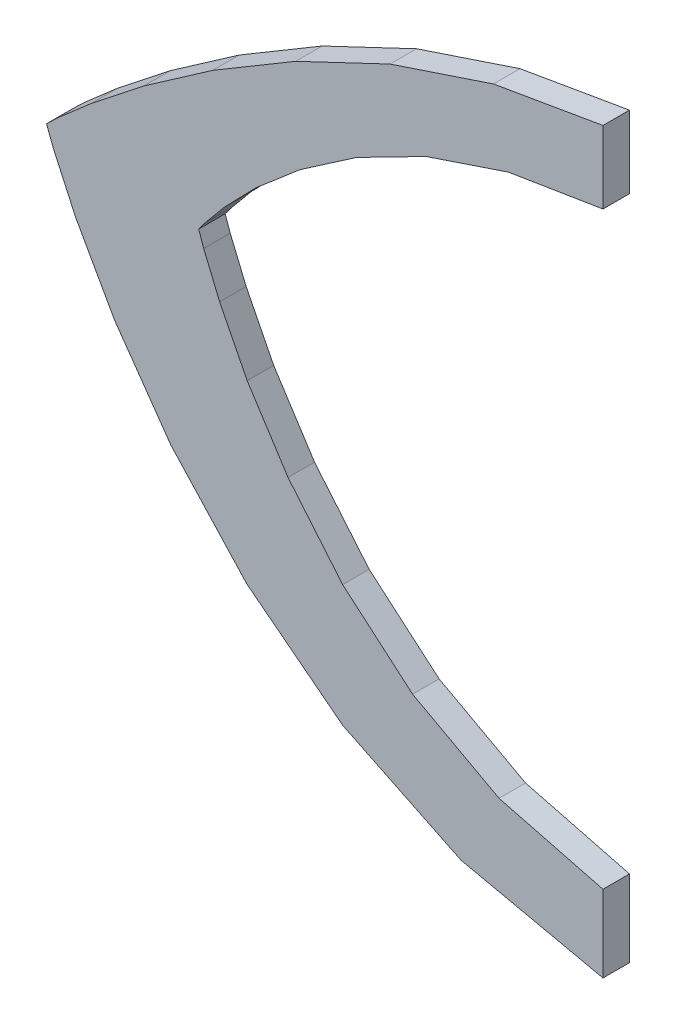
ISO-10303-21;
HEADER;
FILE_DESCRIPTION(('STEP AP214'),'2;1');
FILE_NAME('part.step','',(''),(''),'','','');
FILE_SCHEMA(('AUTOMOTIVE_DESIGN { 1 0 10303 214 1 1 1 1 }'));
ENDSEC;
DATA;
#1=APPLICATION_CONTEXT('core data for automotive mechanical design processes');
#2=APPLICATION_PROTOCOL_DEFINITION('international standard','automotive_design',2000,#1);
#3=PRODUCT_CONTEXT('',#1,'mechanical');
#4=PRODUCT('Part','Part','',(#3));
#5=PRODUCT_RELATED_PRODUCT_CATEGORY('part','',(#4));
#6=PRODUCT_DEFINITION_FORMATION('','',#4);
#7=PRODUCT_DEFINITION_CONTEXT('part definition',#1,'design');
#8=PRODUCT_DEFINITION('design','',#6,#7);
#9=PRODUCT_DEFINITION_SHAPE('','',#8);
#10=(LENGTH_UNIT() NAMED_UNIT(*) SI_UNIT(.MILLI.,.METRE.));
#11=(NAMED_UNIT(*) PLANE_ANGLE_UNIT() SI_UNIT($,.RADIAN.));
#12=(NAMED_UNIT(*) SI_UNIT($,.STERADIAN.) SOLID_ANGLE_UNIT());
#13=UNCERTAINTY_MEASURE_WITH_UNIT(LENGTH_MEASURE(1.E-05),#10,'distance_accuracy_value','');
#14=(GEOMETRIC_REPRESENTATION_CONTEXT(3) GLOBAL_UNCERTAINTY_ASSIGNED_CONTEXT((#13)) GLOBAL_UNIT_ASSIGNED_CONTEXT((#10,
#11,#12)) REPRESENTATION_CONTEXT('',''));
#15=CARTESIAN_POINT('',(0.,0.,0.));
#16=DIRECTION('',(0.,0.,1.));
#17=DIRECTION('',(1.,0.,0.));
#18=AXIS2_PLACEMENT_3D('',#15,#16,#17);
#19=CARTESIAN_POINT('',(0.,0.,0.1));
#20=DIRECTION('',(0.,0.,1.));
#21=DIRECTION('',(1.,0.,0.));
#22=AXIS2_PLACEMENT_3D('',#19,#20,#21);
#23=PLANE('',#22);
#24=DIRECTION('',(0.,1.,0.));
#25=VECTOR('',#24,1.);
#26=CARTESIAN_POINT('',(-1.273,2.135,0.1));
#27=LINE('',#26,#25);
#28=CARTESIAN_POINT('',(-1.273,2.408,0.1));
#29=VERTEX_POINT('',#28);
#30=CARTESIAN_POINT('',(-1.273,2.135,0.1));
#31=VERTEX_POINT('',#30);
#32=EDGE_CURVE('E250',#29,#31,#27,.F.);
#33=ORIENTED_EDGE('',*,*,#32,.F.);
#34=DIRECTION('',(-0.985542665451126,-0.169427431590904,0.));
#35=VECTOR('',#34,1.);
#36=CARTESIAN_POINT('',(-1.273,2.408,0.1));
#37=LINE('',#36,#35);
#38=CARTESIAN_POINT('',(-1.686,2.337,0.1));
#39=VERTEX_POINT('',#38);
#40=EDGE_CURVE('E20',#39,#29,#37,.F.);
#41=ORIENTED_EDGE('',*,*,#40,.F.);
#42=DIRECTION('',(-0.948683298050524,-0.316227766016808,0.));
#43=VECTOR('',#42,1.);
#44=CARTESIAN_POINT('',(-1.686,2.337,0.1));
#45=LINE('',#44,#43);
#46=CARTESIAN_POINT('',(-2.076,2.207,0.1));
#47=VERTEX_POINT('',#46);
#48=EDGE_CURVE('E239',#47,#39,#45,.F.);
#49=ORIENTED_EDGE('',*,*,#48,.F.);
#50=DIRECTION('',(-0.90337582611962,-0.42884976015231,0.));
#51=VECTOR('',#50,1.);
#52=CARTESIAN_POINT('',(-2.076,2.207,0.1));
#53=LINE('',#52,#51);
#54=CARTESIAN_POINT('',(-2.43199999999999,2.038,0.1));
#55=VERTEX_POINT('',#54);
#56=EDGE_CURVE('E234',#55,#47,#53,.F.);
#57=ORIENTED_EDGE('',*,*,#56,.F.);
#58=DIRECTION('',(-0.859666294628866,-0.51085600894878,0.));
#59=VECTOR('',#58,1.);
#60=CARTESIAN_POINT('',(-2.432,2.038,0.1));
#61=LINE('',#60,#59);
#62=CARTESIAN_POINT('',(-2.745,1.852,0.1));
#63=VERTEX_POINT('',#62);
#64=EDGE_CURVE('E261',#63,#55,#61,.F.);
#65=ORIENTED_EDGE('',*,*,#64,.F.);
#66=DIRECTION('',(-0.820712140772254,-0.571341913383768,0.));
#67=VECTOR('',#66,1.);
#68=CARTESIAN_POINT('',(-2.745,1.852,0.1));
#69=LINE('',#68,#67);
#70=CARTESIAN_POINT('',(-3.005,1.671,0.1));
#71=VERTEX_POINT('',#70);
#72=EDGE_CURVE('E265',#71,#63,#69,.F.);
#73=ORIENTED_EDGE('',*,*,#72,.F.);
#74=DIRECTION('',(-0.785491672227528,-0.618872226603522,0.));
#75=VECTOR('',#74,1.);
#76=CARTESIAN_POINT('',(-3.005,1.671,0.1));
#77=LINE('',#76,#75);
#78=CARTESIAN_POINT('',(-3.203,1.515,0.1));
#79=VERTEX_POINT('',#78);
#80=EDGE_CURVE('E269',#79,#71,#77,.F.);
#81=ORIENTED_EDGE('',*,*,#80,.F.);
#82=DIRECTION('',(-0.753696144531098,-0.657223038031198,0.));
#83=VECTOR('',#82,1.);
#84=CARTESIAN_POINT('',(-3.203,1.515,0.1));
#85=LINE('',#84,#83);
#86=CARTESIAN_POINT('',(-3.32800000000001,1.40599999999999,0.1));
#87=VERTEX_POINT('',#86);
#88=EDGE_CURVE('E273',#87,#79,#85,.F.);
#89=ORIENTED_EDGE('',*,*,#88,.F.);
#90=DIRECTION('',(-0.723355544143586,-0.690475746682486,0.));
#91=VECTOR('',#90,1.);
#92=CARTESIAN_POINT('',(-3.328,1.406,0.1));
#93=LINE('',#92,#91);
#94=CARTESIAN_POINT('',(-3.372,1.364,0.1));
#95=VERTEX_POINT('',#94);
#96=EDGE_CURVE('E277',#95,#87,#93,.F.);
#97=ORIENTED_EDGE('',*,*,#96,.F.);
#98=DIRECTION('',(0.357137466266594,-0.934051834851084,0.));
#99=VECTOR('',#98,1.);
#100=CARTESIAN_POINT('',(-3.372,1.364,0.1));
#101=LINE('',#100,#99);
#102=CARTESIAN_POINT('',(-3.346,1.296,0.1));
#103=VERTEX_POINT('',#102);
#104=EDGE_CURVE('E281',#103,#95,#101,.F.);
#105=ORIENTED_EDGE('',*,*,#104,.F.);
#106=DIRECTION('',(0.417167660330626,-0.908829545720357,0.));
#107=VECTOR('',#106,1.);
#108=CARTESIAN_POINT('',(-3.346,1.296,0.1));
#109=LINE('',#108,#107);
#110=CARTESIAN_POINT('',(-3.262,1.113,0.1));
#111=VERTEX_POINT('',#110);
#112=EDGE_CURVE('E285',#111,#103,#109,.F.);
#113=ORIENTED_EDGE('',*,*,#112,.F.);
#114=DIRECTION('',(0.488196030871121,-0.872734000392837,0.));
#115=VECTOR('',#114,1.);
#116=CARTESIAN_POINT('',(-3.262,1.113,0.1));
#117=LINE('',#116,#115);
#118=CARTESIAN_POINT('',(-3.116,0.852000000000004,0.1));
#119=VERTEX_POINT('',#118);
#120=EDGE_CURVE('E289',#119,#111,#117,.F.);
#121=ORIENTED_EDGE('',*,*,#120,.F.);
#122=DIRECTION('',(0.575092058033521,-0.81808870227303,0.));
#123=VECTOR('',#122,1.);
#124=CARTESIAN_POINT('',(-3.116,0.852,0.1));
#125=LINE('',#124,#123);
#126=CARTESIAN_POINT('',(-2.903,0.549,0.1));
#127=VERTEX_POINT('',#126);
#128=EDGE_CURVE('E293',#127,#119,#125,.F.);
#129=ORIENTED_EDGE('',*,*,#128,.F.);
#130=DIRECTION('',(0.678083132935104,-0.734985214020605,0.));
#131=VECTOR('',#130,1.);
#132=CARTESIAN_POINT('',(-2.903,0.549,0.1));
#133=LINE('',#132,#131);
#134=CARTESIAN_POINT('',(-2.617,0.238999999999997,0.1));
#135=VERTEX_POINT('',#134);
#136=EDGE_CURVE('E297',#135,#127,#133,.F.);
#137=ORIENTED_EDGE('',*,*,#136,.F.);
#138=DIRECTION('',(0.789703513653656,-0.613488680028466,0.));
#139=VECTOR('',#138,1.);
#140=CARTESIAN_POINT('',(-2.617,0.239,0.1));
#141=LINE('',#140,#139);
#142=CARTESIAN_POINT('',(-2.254,-0.0430000000000001,0.1));
#143=VERTEX_POINT('',#142);
#144=EDGE_CURVE('E301',#143,#135,#141,.F.);
#145=ORIENTED_EDGE('',*,*,#144,.F.);
#146=DIRECTION('',(0.899213651674576,-0.437509781195888,0.));
#147=VECTOR('',#146,1.);
#148=CARTESIAN_POINT('',(-2.254,-0.043,0.1));
#149=LINE('',#148,#147);
#150=CARTESIAN_POINT('',(-1.808,-0.259999999999996,0.1));
#151=VERTEX_POINT('',#150);
#152=EDGE_CURVE('E305',#151,#143,#149,.F.);
#153=ORIENTED_EDGE('',*,*,#152,.F.);
#154=DIRECTION('',(0.976911928297088,-0.213642421702397,0.));
#155=VECTOR('',#154,1.);
#156=CARTESIAN_POINT('',(-1.808,-0.26,0.1));
#157=LINE('',#156,#155);
#158=CARTESIAN_POINT('',(-1.273,-0.377000000000006,0.1));
#159=VERTEX_POINT('',#158);
#160=EDGE_CURVE('E309',#159,#151,#157,.F.);
#161=ORIENTED_EDGE('',*,*,#160,.F.);
#162=DIRECTION('',(0.,1.,0.));
#163=VECTOR('',#162,1.);
#164=CARTESIAN_POINT('',(-1.273,-0.377,0.1));
#165=LINE('',#164,#163);
#166=CARTESIAN_POINT('',(-1.273,-0.087,0.1));
#167=VERTEX_POINT('',#166);
#168=EDGE_CURVE('E313',#167,#159,#165,.F.);
#169=ORIENTED_EDGE('',*,*,#168,.F.);
#170=DIRECTION('',(-0.968373655198001,0.2495044366709,0.));
#171=VECTOR('',#170,1.);
#172=CARTESIAN_POINT('',(-1.273,-0.087,0.1));
#173=LINE('',#172,#171);
#174=CARTESIAN_POINT('',(-1.665,0.0139999999999987,0.1));
#175=VERTEX_POINT('',#174);
#176=EDGE_CURVE('E317',#175,#167,#173,.F.);
#177=ORIENTED_EDGE('',*,*,#176,.F.);
#178=DIRECTION('',(-0.878821134799304,0.477151352329702,0.));
#179=VECTOR('',#178,1.);
#180=CARTESIAN_POINT('',(-1.665,0.014,0.1));
#181=LINE('',#180,#179);
#182=CARTESIAN_POINT('',(-1.991,0.191000000000001,0.1));
#183=VERTEX_POINT('',#182);
#184=EDGE_CURVE('E321',#183,#175,#181,.F.);
#185=ORIENTED_EDGE('',*,*,#184,.F.);
#186=DIRECTION('',(-0.759662691176328,0.650317303810024,0.));
#187=VECTOR('',#186,1.);
#188=CARTESIAN_POINT('',(-1.991,0.191,0.1));
#189=LINE('',#188,#187);
#190=CARTESIAN_POINT('',(-2.255,0.417,0.1));
#191=VERTEX_POINT('',#190);
#192=EDGE_CURVE('E325',#191,#183,#189,.F.);
#193=ORIENTED_EDGE('',*,*,#192,.F.);
#194=DIRECTION('',(-0.640490169486701,0.767966368268101,0.));
#195=VECTOR('',#194,1.);
#196=CARTESIAN_POINT('',(-2.255,0.417,0.1));
#197=LINE('',#196,#195);
#198=CARTESIAN_POINT('',(-2.461,0.664000000000002,0.1));
#199=VERTEX_POINT('',#198);
#200=EDGE_CURVE('E329',#199,#191,#197,.F.);
#201=ORIENTED_EDGE('',*,*,#200,.F.);
#202=DIRECTION('',(-0.541646108128985,0.840606622355977,0.));
#203=VECTOR('',#202,1.);
#204=CARTESIAN_POINT('',(-2.461,0.664,0.1));
#205=LINE('',#204,#203);
#206=CARTESIAN_POINT('',(-2.615,0.903000000000002,0.1));
#207=VERTEX_POINT('',#206);
#208=EDGE_CURVE('E333',#207,#199,#205,.F.);
#209=ORIENTED_EDGE('',*,*,#208,.F.);
#210=DIRECTION('',(-0.450676982280118,0.892687099516335,0.));
#211=VECTOR('',#210,1.);
#212=CARTESIAN_POINT('',(-2.615,0.903,0.1));
#213=LINE('',#212,#211);
#214=CARTESIAN_POINT('',(-2.719,1.109,0.1));
#215=VERTEX_POINT('',#214);
#216=EDGE_CURVE('E337',#215,#207,#213,.F.);
#217=ORIENTED_EDGE('',*,*,#216,.F.);
#218=DIRECTION('',(-0.384615384615406,0.923076923076914,0.));
#219=VECTOR('',#218,1.);
#220=CARTESIAN_POINT('',(-2.719,1.109,0.1));
#221=LINE('',#220,#219);
#222=CARTESIAN_POINT('',(-2.779,1.253,0.1));
#223=VERTEX_POINT('',#222);
#224=EDGE_CURVE('E341',#223,#215,#221,.F.);
#225=ORIENTED_EDGE('',*,*,#224,.F.);
#226=DIRECTION('',(-0.331906211590901,0.943312390837402,0.));
#227=VECTOR('',#226,1.);
#228=CARTESIAN_POINT('',(-2.779,1.253,0.1));
#229=LINE('',#228,#227);
#230=CARTESIAN_POINT('',(-2.798,1.307,0.1));
#231=VERTEX_POINT('',#230);
#232=EDGE_CURVE('E345',#231,#223,#229,.F.);
#233=ORIENTED_EDGE('',*,*,#232,.F.);
#234=DIRECTION('',(0.6,0.8,0.));
#235=VECTOR('',#234,1.);
#236=CARTESIAN_POINT('',(-2.798,1.307,0.1));
#237=LINE('',#236,#235);
#238=CARTESIAN_POINT('',(-2.774,1.339,0.1));
#239=VERTEX_POINT('',#238);
#240=EDGE_CURVE('E349',#239,#231,#237,.F.);
#241=ORIENTED_EDGE('',*,*,#240,.F.);
#242=DIRECTION('',(0.637567714034206,0.770394321124707,0.));
#243=VECTOR('',#242,1.);
#244=CARTESIAN_POINT('',(-2.774,1.339,0.1));
#245=LINE('',#244,#243);
#246=CARTESIAN_POINT('',(-2.702,1.426,0.1));
#247=VERTEX_POINT('',#246);
#248=EDGE_CURVE('E353',#247,#239,#245,.F.);
#249=ORIENTED_EDGE('',*,*,#248,.F.);
#250=DIRECTION('',(0.695324089139889,0.718696327430288,0.));
#251=VECTOR('',#250,1.);
#252=CARTESIAN_POINT('',(-2.702,1.426,0.1));
#253=LINE('',#252,#251);
#254=CARTESIAN_POINT('',(-2.583,1.549,0.1));
#255=VERTEX_POINT('',#254);
#256=EDGE_CURVE('E357',#255,#247,#253,.F.);
#257=ORIENTED_EDGE('',*,*,#256,.F.);
#258=DIRECTION('',(0.75957757128908,0.650416722720583,0.));
#259=VECTOR('',#258,1.);
#260=CARTESIAN_POINT('',(-2.583,1.549,0.1));
#261=LINE('',#260,#259);
#262=CARTESIAN_POINT('',(-2.416,1.692,0.1));
#263=VERTEX_POINT('',#262);
#264=EDGE_CURVE('E361',#263,#255,#261,.F.);
#265=ORIENTED_EDGE('',*,*,#264,.F.);
#266=DIRECTION('',(0.824266627754376,0.566201842429384,0.));
#267=VECTOR('',#266,1.);
#268=CARTESIAN_POINT('',(-2.416,1.692,0.1));
#269=LINE('',#268,#267);
#270=CARTESIAN_POINT('',(-2.202,1.839,0.1));
#271=VERTEX_POINT('',#270);
#272=EDGE_CURVE('E365',#271,#263,#269,.F.);
#273=ORIENTED_EDGE('',*,*,#272,.F.);
#274=DIRECTION('',(0.89031224250007,0.455350536240485,0.));
#275=VECTOR('',#274,1.);
#276=CARTESIAN_POINT('',(-2.202,1.839,0.1));
#277=LINE('',#276,#275);
#278=CARTESIAN_POINT('',(-1.94,1.973,0.1));
#279=VERTEX_POINT('',#278);
#280=EDGE_CURVE('E369',#279,#271,#277,.F.);
#281=ORIENTED_EDGE('',*,*,#280,.F.);
#282=DIRECTION('',(0.948069865438165,0.318062148405088,0.));
#283=VECTOR('',#282,1.);
#284=CARTESIAN_POINT('',(-1.94,1.973,0.1));
#285=LINE('',#284,#283);
#286=CARTESIAN_POINT('',(-1.63,2.077,0.1));
#287=VERTEX_POINT('',#286);
#288=EDGE_CURVE('E373',#287,#279,#285,.F.);
#289=ORIENTED_EDGE('',*,*,#288,.F.);
#290=DIRECTION('',(0.98705820570375,0.160362397565308,0.));
#291=VECTOR('',#290,1.);
#292=CARTESIAN_POINT('',(-1.63,2.077,0.1));
#293=LINE('',#292,#291);
#294=EDGE_CURVE('E377',#31,#287,#293,.F.);
#295=ORIENTED_EDGE('',*,*,#294,.F.);
#296=EDGE_LOOP('',(#33,#41,#49,#57,#65,#73,#81,#89,#97,#105,#113,#121,#129,#137,#145,#153,#161,
#169,#177,#185,#193,#201,#209,#217,#225,#233,#241,#249,#257,#265,#273,#281,#289,#295));
#297=FACE_BOUND('',#296,.T.);
#298=ADVANCED_FACE('F17',(#297),#23,.T.);
#299=CARTESIAN_POINT('',(-1.273,2.408,0.));
#300=DIRECTION('',(-0.169427431590904,0.985542665451126,0.));
#301=DIRECTION('',(-0.985542665451126,-0.169427431590904,0.));
#302=AXIS2_PLACEMENT_3D('',#299,#300,#301);
#303=PLANE('',#302);
#304=DIRECTION('',(0.,0.,-1.));
#305=VECTOR('',#304,1.);
#306=CARTESIAN_POINT('',(-1.273,2.408,0.));
#307=LINE('',#306,#305);
#308=CARTESIAN_POINT('',(-1.273,2.408,0.));
#309=VERTEX_POINT('',#308);
#310=EDGE_CURVE('E381',#309,#29,#307,.F.);
#311=ORIENTED_EDGE('',*,*,#310,.F.);
#312=DIRECTION('',(-0.985542665451131,-0.169427431590872,0.));
#313=VECTOR('',#312,1.);
#314=CARTESIAN_POINT('',(-1.273,2.408,0.));
#315=LINE('',#314,#313);
#316=CARTESIAN_POINT('',(-1.686,2.33699999999999,0.));
#317=VERTEX_POINT('',#316);
#318=EDGE_CURVE('E256',#309,#317,#315,.T.);
#319=ORIENTED_EDGE('',*,*,#318,.T.);
#320=DIRECTION('',(0.,0.,1.));
#321=VECTOR('',#320,1.);
#322=CARTESIAN_POINT('',(-1.686,2.337,0.));
#323=LINE('',#322,#321);
#324=EDGE_CURVE('E244',#39,#317,#323,.F.);
#325=ORIENTED_EDGE('',*,*,#324,.F.);
#326=ORIENTED_EDGE('',*,*,#40,.T.);
#327=EDGE_LOOP('',(#311,#319,#325,#326));
#328=FACE_BOUND('',#327,.T.);
#329=ADVANCED_FACE('F255',(#328),#303,.T.);
#330=CARTESIAN_POINT('',(-1.686,2.337,0.));
#331=DIRECTION('',(-0.316227766016808,0.948683298050524,0.));
#332=DIRECTION('',(-0.948683298050524,-0.316227766016808,0.));
#333=AXIS2_PLACEMENT_3D('',#330,#331,#332);
#334=PLANE('',#333);
#335=ORIENTED_EDGE('',*,*,#324,.T.);
#336=DIRECTION('',(-0.948683298050514,-0.316227766016839,0.));
#337=VECTOR('',#336,1.);
#338=CARTESIAN_POINT('',(-1.686,2.337,0.));
#339=LINE('',#338,#337);
#340=CARTESIAN_POINT('',(-2.076,2.20700000000001,0.));
#341=VERTEX_POINT('',#340);
#342=EDGE_CURVE('E386',#317,#341,#339,.T.);
#343=ORIENTED_EDGE('',*,*,#342,.T.);
#344=DIRECTION('',(0.,0.,1.));
#345=VECTOR('',#344,1.);
#346=CARTESIAN_POINT('',(-2.076,2.207,0.));
#347=LINE('',#346,#345);
#348=EDGE_CURVE('E246',#47,#341,#347,.F.);
#349=ORIENTED_EDGE('',*,*,#348,.F.);
#350=ORIENTED_EDGE('',*,*,#48,.T.);
#351=EDGE_LOOP('',(#335,#343,#349,#350));
#352=FACE_BOUND('',#351,.T.);
#353=ADVANCED_FACE('F241',(#352),#334,.T.);
#354=CARTESIAN_POINT('',(-2.076,2.207,0.));
#355=DIRECTION('',(-0.42884976015231,0.90337582611962,0.));
#356=DIRECTION('',(-0.90337582611962,-0.42884976015231,0.));
#357=AXIS2_PLACEMENT_3D('',#354,#355,#356);
#358=PLANE('',#357);
#359=ORIENTED_EDGE('',*,*,#348,.T.);
#360=DIRECTION('',(-0.903375826119627,-0.428849760152295,0.));
#361=VECTOR('',#360,1.);
#362=CARTESIAN_POINT('',(-2.076,2.207,0.));
#363=LINE('',#362,#361);
#364=CARTESIAN_POINT('',(-2.43199999999999,2.038,0.));
#365=VERTEX_POINT('',#364);
#366=EDGE_CURVE('E388',#341,#365,#363,.T.);
#367=ORIENTED_EDGE('',*,*,#366,.T.);
#368=DIRECTION('',(0.,0.,1.));
#369=VECTOR('',#368,1.);
#370=CARTESIAN_POINT('',(-2.432,2.038,0.));
#371=LINE('',#370,#369);
#372=EDGE_CURVE('E263',#55,#365,#371,.F.);
#373=ORIENTED_EDGE('',*,*,#372,.F.);
#374=ORIENTED_EDGE('',*,*,#56,.T.);
#375=EDGE_LOOP('',(#359,#367,#373,#374));
#376=FACE_BOUND('',#375,.T.);
#377=ADVANCED_FACE('F630',(#376),#358,.T.);
#378=CARTESIAN_POINT('',(-2.432,2.038,0.));
#379=DIRECTION('',(-0.51085600894878,0.859666294628866,0.));
#380=DIRECTION('',(-0.859666294628866,-0.51085600894878,0.));
#381=AXIS2_PLACEMENT_3D('',#378,#379,#380);
#382=PLANE('',#381);
#383=ORIENTED_EDGE('',*,*,#372,.T.);
#384=DIRECTION('',(-0.859666294628865,-0.510856008948782,0.));
#385=VECTOR('',#384,1.);
#386=CARTESIAN_POINT('',(-2.432,2.038,0.));
#387=LINE('',#386,#385);
#388=CARTESIAN_POINT('',(-2.745,1.852,0.));
#389=VERTEX_POINT('',#388);
#390=EDGE_CURVE('E391',#365,#389,#387,.T.);
#391=ORIENTED_EDGE('',*,*,#390,.T.);
#392=DIRECTION('',(0.,0.,1.));
#393=VECTOR('',#392,1.);
#394=CARTESIAN_POINT('',(-2.745,1.852,0.));
#395=LINE('',#394,#393);
#396=EDGE_CURVE('E267',#63,#389,#395,.F.);
#397=ORIENTED_EDGE('',*,*,#396,.F.);
#398=ORIENTED_EDGE('',*,*,#64,.T.);
#399=EDGE_LOOP('',(#383,#391,#397,#398));
#400=FACE_BOUND('',#399,.T.);
#401=ADVANCED_FACE('F629',(#400),#382,.T.);
#402=CARTESIAN_POINT('',(-2.745,1.852,0.));
#403=DIRECTION('',(-0.571341913383768,0.820712140772254,0.));
#404=DIRECTION('',(-0.820712140772254,-0.571341913383768,0.));
#405=AXIS2_PLACEMENT_3D('',#402,#403,#404);
#406=PLANE('',#405);
#407=ORIENTED_EDGE('',*,*,#396,.T.);
#408=DIRECTION('',(-0.820712140772256,-0.571341913383763,0.));
#409=VECTOR('',#408,1.);
#410=CARTESIAN_POINT('',(-2.745,1.852,0.));
#411=LINE('',#410,#409);
#412=CARTESIAN_POINT('',(-3.005,1.671,0.));
#413=VERTEX_POINT('',#412);
#414=EDGE_CURVE('E394',#389,#413,#411,.T.);
#415=ORIENTED_EDGE('',*,*,#414,.T.);
#416=DIRECTION('',(0.,0.,1.));
#417=VECTOR('',#416,1.);
#418=CARTESIAN_POINT('',(-3.005,1.671,0.));
#419=LINE('',#418,#417);
#420=EDGE_CURVE('E271',#71,#413,#419,.F.);
#421=ORIENTED_EDGE('',*,*,#420,.F.);
#422=ORIENTED_EDGE('',*,*,#72,.T.);
#423=EDGE_LOOP('',(#407,#415,#421,#422));
#424=FACE_BOUND('',#423,.T.);
#425=ADVANCED_FACE('F623',(#424),#406,.T.);
#426=CARTESIAN_POINT('',(-3.005,1.671,0.));
#427=DIRECTION('',(-0.618872226603522,0.785491672227528,0.));
#428=DIRECTION('',(-0.785491672227528,-0.618872226603522,0.));
#429=AXIS2_PLACEMENT_3D('',#426,#427,#428);
#430=PLANE('',#429);
#431=ORIENTED_EDGE('',*,*,#420,.T.);
#432=DIRECTION('',(-0.785491672227535,-0.618872226603513,0.));
#433=VECTOR('',#432,1.);
#434=CARTESIAN_POINT('',(-3.005,1.671,0.));
#435=LINE('',#434,#433);
#436=CARTESIAN_POINT('',(-3.203,1.515,0.));
#437=VERTEX_POINT('',#436);
#438=EDGE_CURVE('E397',#413,#437,#435,.T.);
#439=ORIENTED_EDGE('',*,*,#438,.T.);
#440=DIRECTION('',(0.,0.,1.));
#441=VECTOR('',#440,1.);
#442=CARTESIAN_POINT('',(-3.203,1.515,0.));
#443=LINE('',#442,#441);
#444=EDGE_CURVE('E275',#79,#437,#443,.F.);
#445=ORIENTED_EDGE('',*,*,#444,.F.);
#446=ORIENTED_EDGE('',*,*,#80,.T.);
#447=EDGE_LOOP('',(#431,#439,#445,#446));
#448=FACE_BOUND('',#447,.T.);
#449=ADVANCED_FACE('F619',(#448),#430,.T.);
#450=CARTESIAN_POINT('',(-3.203,1.515,0.));
#451=DIRECTION('',(-0.657223038031198,0.753696144531098,0.));
#452=DIRECTION('',(-0.753696144531098,-0.657223038031198,0.));
#453=AXIS2_PLACEMENT_3D('',#450,#451,#452);
#454=PLANE('',#453);
#455=ORIENTED_EDGE('',*,*,#444,.T.);
#456=DIRECTION('',(-0.753696144531138,-0.657223038031153,0.));
#457=VECTOR('',#456,1.);
#458=CARTESIAN_POINT('',(-3.203,1.515,0.));
#459=LINE('',#458,#457);
#460=CARTESIAN_POINT('',(-3.328,1.40599999999999,0.));
#461=VERTEX_POINT('',#460);
#462=EDGE_CURVE('E400',#437,#461,#459,.T.);
#463=ORIENTED_EDGE('',*,*,#462,.T.);
#464=DIRECTION('',(0.,0.,1.));
#465=VECTOR('',#464,1.);
#466=CARTESIAN_POINT('',(-3.328,1.406,0.));
#467=LINE('',#466,#465);
#468=EDGE_CURVE('E279',#87,#461,#467,.F.);
#469=ORIENTED_EDGE('',*,*,#468,.F.);
#470=ORIENTED_EDGE('',*,*,#88,.T.);
#471=EDGE_LOOP('',(#455,#463,#469,#470));
#472=FACE_BOUND('',#471,.T.);
#473=ADVANCED_FACE('F613',(#472),#454,.T.);
#474=CARTESIAN_POINT('',(-3.328,1.406,0.));
#475=DIRECTION('',(-0.690475746682486,0.723355544143586,0.));
#476=DIRECTION('',(-0.723355544143586,-0.690475746682486,0.));
#477=AXIS2_PLACEMENT_3D('',#474,#475,#476);
#478=PLANE('',#477);
#479=ORIENTED_EDGE('',*,*,#468,.T.);
#480=DIRECTION('',(-0.723355544143576,-0.690475746682496,0.));
#481=VECTOR('',#480,1.);
#482=CARTESIAN_POINT('',(-3.328,1.406,0.));
#483=LINE('',#482,#481);
#484=CARTESIAN_POINT('',(-3.372,1.364,0.));
#485=VERTEX_POINT('',#484);
#486=EDGE_CURVE('E403',#461,#485,#483,.T.);
#487=ORIENTED_EDGE('',*,*,#486,.T.);
#488=DIRECTION('',(0.,0.,1.));
#489=VECTOR('',#488,1.);
#490=CARTESIAN_POINT('',(-3.372,1.364,0.));
#491=LINE('',#490,#489);
#492=EDGE_CURVE('E283',#95,#485,#491,.F.);
#493=ORIENTED_EDGE('',*,*,#492,.F.);
#494=ORIENTED_EDGE('',*,*,#96,.T.);
#495=EDGE_LOOP('',(#479,#487,#493,#494));
#496=FACE_BOUND('',#495,.T.);
#497=ADVANCED_FACE('F609',(#496),#478,.T.);
#498=CARTESIAN_POINT('',(-3.372,1.364,0.));
#499=DIRECTION('',(-0.934051834851084,-0.357137466266594,0.));
#500=DIRECTION('',(0.357137466266594,-0.934051834851084,0.));
#501=AXIS2_PLACEMENT_3D('',#498,#499,#500);
#502=PLANE('',#501);
#503=ORIENTED_EDGE('',*,*,#492,.T.);
#504=DIRECTION('',(0.357137466266591,-0.934051834851086,0.));
#505=VECTOR('',#504,1.);
#506=CARTESIAN_POINT('',(-3.372,1.364,0.));
#507=LINE('',#506,#505);
#508=CARTESIAN_POINT('',(-3.346,1.296,0.));
#509=VERTEX_POINT('',#508);
#510=EDGE_CURVE('E406',#485,#509,#507,.T.);
#511=ORIENTED_EDGE('',*,*,#510,.T.);
#512=DIRECTION('',(0.,0.,1.));
#513=VECTOR('',#512,1.);
#514=CARTESIAN_POINT('',(-3.346,1.296,0.));
#515=LINE('',#514,#513);
#516=EDGE_CURVE('E287',#103,#509,#515,.F.);
#517=ORIENTED_EDGE('',*,*,#516,.F.);
#518=ORIENTED_EDGE('',*,*,#104,.T.);
#519=EDGE_LOOP('',(#503,#511,#517,#518));
#520=FACE_BOUND('',#519,.T.);
#521=ADVANCED_FACE('F603',(#520),#502,.T.);
#522=CARTESIAN_POINT('',(-3.346,1.296,0.));
#523=DIRECTION('',(-0.908829545720357,-0.417167660330626,0.));
#524=DIRECTION('',(0.417167660330626,-0.908829545720357,0.));
#525=AXIS2_PLACEMENT_3D('',#522,#523,#524);
#526=PLANE('',#525);
#527=ORIENTED_EDGE('',*,*,#516,.T.);
#528=DIRECTION('',(0.41716766033065,-0.908829545720346,0.));
#529=VECTOR('',#528,1.);
#530=CARTESIAN_POINT('',(-3.346,1.296,0.));
#531=LINE('',#530,#529);
#532=CARTESIAN_POINT('',(-3.262,1.113,0.));
#533=VERTEX_POINT('',#532);
#534=EDGE_CURVE('E409',#509,#533,#531,.T.);
#535=ORIENTED_EDGE('',*,*,#534,.T.);
#536=DIRECTION('',(0.,0.,1.));
#537=VECTOR('',#536,1.);
#538=CARTESIAN_POINT('',(-3.262,1.113,0.));
#539=LINE('',#538,#537);
#540=EDGE_CURVE('E291',#111,#533,#539,.F.);
#541=ORIENTED_EDGE('',*,*,#540,.F.);
#542=ORIENTED_EDGE('',*,*,#112,.T.);
#543=EDGE_LOOP('',(#527,#535,#541,#542));
#544=FACE_BOUND('',#543,.T.);
#545=ADVANCED_FACE('F599',(#544),#526,.T.);
#546=CARTESIAN_POINT('',(-3.262,1.113,0.));
#547=DIRECTION('',(-0.872734000392837,-0.488196030871121,0.));
#548=DIRECTION('',(0.488196030871121,-0.872734000392837,0.));
#549=AXIS2_PLACEMENT_3D('',#546,#547,#548);
#550=PLANE('',#549);
#551=ORIENTED_EDGE('',*,*,#540,.T.);
#552=DIRECTION('',(0.488196030871096,-0.872734000392851,0.));
#553=VECTOR('',#552,1.);
#554=CARTESIAN_POINT('',(-3.262,1.113,0.));
#555=LINE('',#554,#553);
#556=CARTESIAN_POINT('',(-3.116,0.852000000000004,0.));
#557=VERTEX_POINT('',#556);
#558=EDGE_CURVE('E412',#533,#557,#555,.T.);
#559=ORIENTED_EDGE('',*,*,#558,.T.);
#560=DIRECTION('',(0.,0.,1.));
#561=VECTOR('',#560,1.);
#562=CARTESIAN_POINT('',(-3.116,0.852,0.));
#563=LINE('',#562,#561);
#564=EDGE_CURVE('E295',#119,#557,#563,.F.);
#565=ORIENTED_EDGE('',*,*,#564,.F.);
#566=ORIENTED_EDGE('',*,*,#120,.T.);
#567=EDGE_LOOP('',(#551,#559,#565,#566));
#568=FACE_BOUND('',#567,.T.);
#569=ADVANCED_FACE('F593',(#568),#550,.T.);
#570=CARTESIAN_POINT('',(-3.116,0.852,0.));
#571=DIRECTION('',(-0.81808870227303,-0.575092058033521,0.));
#572=DIRECTION('',(0.575092058033521,-0.81808870227303,0.));
#573=AXIS2_PLACEMENT_3D('',#570,#571,#572);
#574=PLANE('',#573);
#575=ORIENTED_EDGE('',*,*,#564,.T.);
#576=DIRECTION('',(0.575092058033518,-0.818088702273032,0.));
#577=VECTOR('',#576,1.);
#578=CARTESIAN_POINT('',(-3.116,0.852,0.));
#579=LINE('',#578,#577);
#580=CARTESIAN_POINT('',(-2.903,0.549,0.));
#581=VERTEX_POINT('',#580);
#582=EDGE_CURVE('E415',#557,#581,#579,.T.);
#583=ORIENTED_EDGE('',*,*,#582,.T.);
#584=DIRECTION('',(0.,0.,1.));
#585=VECTOR('',#584,1.);
#586=CARTESIAN_POINT('',(-2.903,0.549,0.));
#587=LINE('',#586,#585);
#588=EDGE_CURVE('E299',#127,#581,#587,.F.);
#589=ORIENTED_EDGE('',*,*,#588,.F.);
#590=ORIENTED_EDGE('',*,*,#128,.T.);
#591=EDGE_LOOP('',(#575,#583,#589,#590));
#592=FACE_BOUND('',#591,.T.);
#593=ADVANCED_FACE('F589',(#592),#574,.T.);
#594=CARTESIAN_POINT('',(-2.903,0.549,0.));
#595=DIRECTION('',(-0.734985214020605,-0.678083132935104,0.));
#596=DIRECTION('',(0.678083132935104,-0.734985214020605,0.));
#597=AXIS2_PLACEMENT_3D('',#594,#595,#596);
#598=PLANE('',#597);
#599=ORIENTED_EDGE('',*,*,#588,.T.);
#600=DIRECTION('',(0.678083132935123,-0.734985214020587,0.));
#601=VECTOR('',#600,1.);
#602=CARTESIAN_POINT('',(-2.903,0.549,0.));
#603=LINE('',#602,#601);
#604=CARTESIAN_POINT('',(-2.617,0.238999999999996,0.));
#605=VERTEX_POINT('',#604);
#606=EDGE_CURVE('E418',#581,#605,#603,.T.);
#607=ORIENTED_EDGE('',*,*,#606,.T.);
#608=DIRECTION('',(0.,0.,1.));
#609=VECTOR('',#608,1.);
#610=CARTESIAN_POINT('',(-2.617,0.239,0.));
#611=LINE('',#610,#609);
#612=EDGE_CURVE('E303',#135,#605,#611,.F.);
#613=ORIENTED_EDGE('',*,*,#612,.F.);
#614=ORIENTED_EDGE('',*,*,#136,.T.);
#615=EDGE_LOOP('',(#599,#607,#613,#614));
#616=FACE_BOUND('',#615,.T.);
#617=ADVANCED_FACE('F583',(#616),#598,.T.);
#618=CARTESIAN_POINT('',(-2.617,0.239,0.));
#619=DIRECTION('',(-0.613488680028466,-0.789703513653656,0.));
#620=DIRECTION('',(0.789703513653656,-0.613488680028466,0.));
#621=AXIS2_PLACEMENT_3D('',#618,#619,#620);
#622=PLANE('',#621);
#623=ORIENTED_EDGE('',*,*,#612,.T.);
#624=DIRECTION('',(0.789703513653659,-0.613488680028462,0.));
#625=VECTOR('',#624,1.);
#626=CARTESIAN_POINT('',(-2.617,0.239,0.));
#627=LINE('',#626,#625);
#628=CARTESIAN_POINT('',(-2.254,-0.0430000000000007,0.));
#629=VERTEX_POINT('',#628);
#630=EDGE_CURVE('E421',#605,#629,#627,.T.);
#631=ORIENTED_EDGE('',*,*,#630,.T.);
#632=DIRECTION('',(0.,0.,1.));
#633=VECTOR('',#632,1.);
#634=CARTESIAN_POINT('',(-2.254,-0.043,0.));
#635=LINE('',#634,#633);
#636=EDGE_CURVE('E307',#143,#629,#635,.F.);
#637=ORIENTED_EDGE('',*,*,#636,.F.);
#638=ORIENTED_EDGE('',*,*,#144,.T.);
#639=EDGE_LOOP('',(#623,#631,#637,#638));
#640=FACE_BOUND('',#639,.T.);
#641=ADVANCED_FACE('F579',(#640),#622,.T.);
#642=CARTESIAN_POINT('',(-2.254,-0.043,0.));
#643=DIRECTION('',(-0.437509781195888,-0.899213651674576,0.));
#644=DIRECTION('',(0.899213651674576,-0.437509781195888,0.));
#645=AXIS2_PLACEMENT_3D('',#642,#643,#644);
#646=PLANE('',#645);
#647=ORIENTED_EDGE('',*,*,#636,.T.);
#648=DIRECTION('',(0.899213651674561,-0.437509781195919,0.));
#649=VECTOR('',#648,1.);
#650=CARTESIAN_POINT('',(-2.254,-0.043,0.));
#651=LINE('',#650,#649);
#652=CARTESIAN_POINT('',(-1.808,-0.259999999999992,0.));
#653=VERTEX_POINT('',#652);
#654=EDGE_CURVE('E424',#629,#653,#651,.T.);
#655=ORIENTED_EDGE('',*,*,#654,.T.);
#656=DIRECTION('',(0.,0.,1.));
#657=VECTOR('',#656,1.);
#658=CARTESIAN_POINT('',(-1.808,-0.26,0.));
#659=LINE('',#658,#657);
#660=EDGE_CURVE('E311',#151,#653,#659,.F.);
#661=ORIENTED_EDGE('',*,*,#660,.F.);
#662=ORIENTED_EDGE('',*,*,#152,.T.);
#663=EDGE_LOOP('',(#647,#655,#661,#662));
#664=FACE_BOUND('',#663,.T.);
#665=ADVANCED_FACE('F573',(#664),#646,.T.);
#666=CARTESIAN_POINT('',(-1.808,-0.26,0.));
#667=DIRECTION('',(-0.213642421702397,-0.976911928297088,0.));
#668=DIRECTION('',(0.976911928297088,-0.213642421702397,0.));
#669=AXIS2_PLACEMENT_3D('',#666,#667,#668);
#670=PLANE('',#669);
#671=ORIENTED_EDGE('',*,*,#660,.T.);
#672=DIRECTION('',(0.976911928297097,-0.213642421702356,0.));
#673=VECTOR('',#672,1.);
#674=CARTESIAN_POINT('',(-1.808,-0.26,0.));
#675=LINE('',#674,#673);
#676=CARTESIAN_POINT('',(-1.273,-0.377000000000011,0.));
#677=VERTEX_POINT('',#676);
#678=EDGE_CURVE('E427',#653,#677,#675,.T.);
#679=ORIENTED_EDGE('',*,*,#678,.T.);
#680=DIRECTION('',(0.,0.,-1.));
#681=VECTOR('',#680,1.);
#682=CARTESIAN_POINT('',(-1.273,-0.377,0.));
#683=LINE('',#682,#681);
#684=EDGE_CURVE('E315',#159,#677,#683,.T.);
#685=ORIENTED_EDGE('',*,*,#684,.F.);
#686=ORIENTED_EDGE('',*,*,#160,.T.);
#687=EDGE_LOOP('',(#671,#679,#685,#686));
#688=FACE_BOUND('',#687,.T.);
#689=ADVANCED_FACE('F569',(#688),#670,.T.);
#690=CARTESIAN_POINT('',(-1.273,-0.377,0.));
#691=DIRECTION('',(1.,0.,0.));
#692=DIRECTION('',(0.,0.,-1.));
#693=AXIS2_PLACEMENT_3D('',#690,#691,#692);
#694=PLANE('',#693);
#695=ORIENTED_EDGE('',*,*,#684,.T.);
#696=DIRECTION('',(0.,1.,0.));
#697=VECTOR('',#696,1.);
#698=CARTESIAN_POINT('',(-1.273,0.,0.));
#699=LINE('',#698,#697);
#700=CARTESIAN_POINT('',(-1.273,-0.087,0.));
#701=VERTEX_POINT('',#700);
#702=EDGE_CURVE('E430',#677,#701,#699,.T.);
#703=ORIENTED_EDGE('',*,*,#702,.T.);
#704=DIRECTION('',(0.,0.,1.));
#705=VECTOR('',#704,1.);
#706=CARTESIAN_POINT('',(-1.273,-0.087,0.));
#707=LINE('',#706,#705);
#708=EDGE_CURVE('E319',#167,#701,#707,.F.);
#709=ORIENTED_EDGE('',*,*,#708,.F.);
#710=ORIENTED_EDGE('',*,*,#168,.T.);
#711=EDGE_LOOP('',(#695,#703,#709,#710));
#712=FACE_BOUND('',#711,.T.);
#713=ADVANCED_FACE('F563',(#712),#694,.T.);
#714=CARTESIAN_POINT('',(-1.273,-0.087,0.));
#715=DIRECTION('',(0.2495044366709,0.968373655198001,0.));
#716=DIRECTION('',(-0.968373655198001,0.2495044366709,0.));
#717=AXIS2_PLACEMENT_3D('',#714,#715,#716);
#718=PLANE('',#717);
#719=ORIENTED_EDGE('',*,*,#708,.T.);
#720=DIRECTION('',(-0.968373655197998,0.249504436670913,0.));
#721=VECTOR('',#720,1.);
#722=CARTESIAN_POINT('',(-1.273,-0.087,0.));
#723=LINE('',#722,#721);
#724=CARTESIAN_POINT('',(-1.665,0.0139999999999974,0.));
#725=VERTEX_POINT('',#724);
#726=EDGE_CURVE('E433',#701,#725,#723,.T.);
#727=ORIENTED_EDGE('',*,*,#726,.T.);
#728=DIRECTION('',(0.,0.,1.));
#729=VECTOR('',#728,1.);
#730=CARTESIAN_POINT('',(-1.665,0.014,0.));
#731=LINE('',#730,#729);
#732=EDGE_CURVE('E323',#175,#725,#731,.F.);
#733=ORIENTED_EDGE('',*,*,#732,.F.);
#734=ORIENTED_EDGE('',*,*,#176,.T.);
#735=EDGE_LOOP('',(#719,#727,#733,#734));
#736=FACE_BOUND('',#735,.T.);
#737=ADVANCED_FACE('F559',(#736),#718,.T.);
#738=CARTESIAN_POINT('',(-1.665,0.014,0.));
#739=DIRECTION('',(0.477151352329702,0.878821134799304,0.));
#740=DIRECTION('',(-0.878821134799304,0.477151352329702,0.));
#741=AXIS2_PLACEMENT_3D('',#738,#739,#740);
#742=PLANE('',#741);
#743=ORIENTED_EDGE('',*,*,#732,.T.);
#744=DIRECTION('',(-0.878821134799312,0.477151352329688,0.));
#745=VECTOR('',#744,1.);
#746=CARTESIAN_POINT('',(-1.665,0.014,0.));
#747=LINE('',#746,#745);
#748=CARTESIAN_POINT('',(-1.991,0.191000000000002,0.));
#749=VERTEX_POINT('',#748);
#750=EDGE_CURVE('E436',#725,#749,#747,.T.);
#751=ORIENTED_EDGE('',*,*,#750,.T.);
#752=DIRECTION('',(0.,0.,1.));
#753=VECTOR('',#752,1.);
#754=CARTESIAN_POINT('',(-1.991,0.191,0.));
#755=LINE('',#754,#753);
#756=EDGE_CURVE('E327',#183,#749,#755,.F.);
#757=ORIENTED_EDGE('',*,*,#756,.F.);
#758=ORIENTED_EDGE('',*,*,#184,.T.);
#759=EDGE_LOOP('',(#743,#751,#757,#758));
#760=FACE_BOUND('',#759,.T.);
#761=ADVANCED_FACE('F553',(#760),#742,.T.);
#762=CARTESIAN_POINT('',(-1.991,0.191,0.));
#763=DIRECTION('',(0.650317303810024,0.759662691176328,0.));
#764=DIRECTION('',(-0.759662691176328,0.650317303810024,0.));
#765=AXIS2_PLACEMENT_3D('',#762,#763,#764);
#766=PLANE('',#765);
#767=ORIENTED_EDGE('',*,*,#756,.T.);
#768=DIRECTION('',(-0.759662691176321,0.650317303810032,0.));
#769=VECTOR('',#768,1.);
#770=CARTESIAN_POINT('',(-1.991,0.191,0.));
#771=LINE('',#770,#769);
#772=CARTESIAN_POINT('',(-2.255,0.416999999999999,0.));
#773=VERTEX_POINT('',#772);
#774=EDGE_CURVE('E439',#749,#773,#771,.T.);
#775=ORIENTED_EDGE('',*,*,#774,.T.);
#776=DIRECTION('',(0.,0.,1.));
#777=VECTOR('',#776,1.);
#778=CARTESIAN_POINT('',(-2.255,0.417,0.));
#779=LINE('',#778,#777);
#780=EDGE_CURVE('E331',#191,#773,#779,.F.);
#781=ORIENTED_EDGE('',*,*,#780,.F.);
#782=ORIENTED_EDGE('',*,*,#192,.T.);
#783=EDGE_LOOP('',(#767,#775,#781,#782));
#784=FACE_BOUND('',#783,.T.);
#785=ADVANCED_FACE('F549',(#784),#766,.T.);
#786=CARTESIAN_POINT('',(-2.255,0.417,0.));
#787=DIRECTION('',(0.767966368268101,0.640490169486701,0.));
#788=DIRECTION('',(-0.640490169486701,0.767966368268101,0.));
#789=AXIS2_PLACEMENT_3D('',#786,#787,#788);
#790=PLANE('',#789);
#791=ORIENTED_EDGE('',*,*,#780,.T.);
#792=DIRECTION('',(-0.640490169486734,0.767966368268074,0.));
#793=VECTOR('',#792,1.);
#794=CARTESIAN_POINT('',(-2.255,0.417,0.));
#795=LINE('',#794,#793);
#796=CARTESIAN_POINT('',(-2.461,0.664000000000005,0.));
#797=VERTEX_POINT('',#796);
#798=EDGE_CURVE('E442',#773,#797,#795,.T.);
#799=ORIENTED_EDGE('',*,*,#798,.T.);
#800=DIRECTION('',(0.,0.,1.));
#801=VECTOR('',#800,1.);
#802=CARTESIAN_POINT('',(-2.461,0.664,0.));
#803=LINE('',#802,#801);
#804=EDGE_CURVE('E335',#199,#797,#803,.F.);
#805=ORIENTED_EDGE('',*,*,#804,.F.);
#806=ORIENTED_EDGE('',*,*,#200,.T.);
#807=EDGE_LOOP('',(#791,#799,#805,#806));
#808=FACE_BOUND('',#807,.T.);
#809=ADVANCED_FACE('F543',(#808),#790,.T.);
#810=CARTESIAN_POINT('',(-2.461,0.664,0.));
#811=DIRECTION('',(0.840606622355977,0.541646108128985,0.));
#812=DIRECTION('',(-0.541646108128985,0.840606622355977,0.));
#813=AXIS2_PLACEMENT_3D('',#810,#811,#812);
#814=PLANE('',#813);
#815=ORIENTED_EDGE('',*,*,#804,.T.);
#816=DIRECTION('',(-0.541646108128965,0.84060662235599,0.));
#817=VECTOR('',#816,1.);
#818=CARTESIAN_POINT('',(-2.461,0.664,0.));
#819=LINE('',#818,#817);
#820=CARTESIAN_POINT('',(-2.615,0.903,0.));
#821=VERTEX_POINT('',#820);
#822=EDGE_CURVE('E445',#797,#821,#819,.T.);
#823=ORIENTED_EDGE('',*,*,#822,.T.);
#824=DIRECTION('',(0.,0.,1.));
#825=VECTOR('',#824,1.);
#826=CARTESIAN_POINT('',(-2.615,0.903,0.));
#827=LINE('',#826,#825);
#828=EDGE_CURVE('E339',#207,#821,#827,.F.);
#829=ORIENTED_EDGE('',*,*,#828,.F.);
#830=ORIENTED_EDGE('',*,*,#208,.T.);
#831=EDGE_LOOP('',(#815,#823,#829,#830));
#832=FACE_BOUND('',#831,.T.);
#833=ADVANCED_FACE('F539',(#832),#814,.T.);
#834=CARTESIAN_POINT('',(-2.615,0.903,0.));
#835=DIRECTION('',(0.892687099516335,0.450676982280118,0.));
#836=DIRECTION('',(-0.450676982280118,0.892687099516335,0.));
#837=AXIS2_PLACEMENT_3D('',#834,#835,#836);
#838=PLANE('',#837);
#839=ORIENTED_EDGE('',*,*,#828,.T.);
#840=DIRECTION('',(-0.450676982280097,0.892687099516345,0.));
#841=VECTOR('',#840,1.);
#842=CARTESIAN_POINT('',(-2.615,0.903,0.));
#843=LINE('',#842,#841);
#844=CARTESIAN_POINT('',(-2.719,1.109,0.));
#845=VERTEX_POINT('',#844);
#846=EDGE_CURVE('E448',#821,#845,#843,.T.);
#847=ORIENTED_EDGE('',*,*,#846,.T.);
#848=DIRECTION('',(0.,0.,1.));
#849=VECTOR('',#848,1.);
#850=CARTESIAN_POINT('',(-2.719,1.109,0.));
#851=LINE('',#850,#849);
#852=EDGE_CURVE('E343',#215,#845,#851,.F.);
#853=ORIENTED_EDGE('',*,*,#852,.F.);
#854=ORIENTED_EDGE('',*,*,#216,.T.);
#855=EDGE_LOOP('',(#839,#847,#853,#854));
#856=FACE_BOUND('',#855,.T.);
#857=ADVANCED_FACE('F533',(#856),#838,.T.);
#858=CARTESIAN_POINT('',(-2.719,1.109,0.));
#859=DIRECTION('',(0.923076923076914,0.384615384615406,0.));
#860=DIRECTION('',(-0.384615384615406,0.923076923076914,0.));
#861=AXIS2_PLACEMENT_3D('',#858,#859,#860);
#862=PLANE('',#861);
#863=ORIENTED_EDGE('',*,*,#852,.T.);
#864=DIRECTION('',(-0.384615384615383,0.923076923076924,0.));
#865=VECTOR('',#864,1.);
#866=CARTESIAN_POINT('',(-2.719,1.109,0.));
#867=LINE('',#866,#865);
#868=CARTESIAN_POINT('',(-2.779,1.253,0.));
#869=VERTEX_POINT('',#868);
#870=EDGE_CURVE('E451',#845,#869,#867,.T.);
#871=ORIENTED_EDGE('',*,*,#870,.T.);
#872=DIRECTION('',(0.,0.,1.));
#873=VECTOR('',#872,1.);
#874=CARTESIAN_POINT('',(-2.779,1.253,0.));
#875=LINE('',#874,#873);
#876=EDGE_CURVE('E347',#223,#869,#875,.F.);
#877=ORIENTED_EDGE('',*,*,#876,.F.);
#878=ORIENTED_EDGE('',*,*,#224,.T.);
#879=EDGE_LOOP('',(#863,#871,#877,#878));
#880=FACE_BOUND('',#879,.T.);
#881=ADVANCED_FACE('F529',(#880),#862,.T.);
#882=CARTESIAN_POINT('',(-2.779,1.253,0.));
#883=DIRECTION('',(0.943312390837402,0.331906211590901,0.));
#884=DIRECTION('',(-0.331906211590901,0.943312390837402,0.));
#885=AXIS2_PLACEMENT_3D('',#882,#883,#884);
#886=PLANE('',#885);
#887=ORIENTED_EDGE('',*,*,#876,.T.);
#888=DIRECTION('',(-0.331906211590939,0.943312390837389,0.));
#889=VECTOR('',#888,1.);
#890=CARTESIAN_POINT('',(-2.779,1.253,0.));
#891=LINE('',#890,#889);
#892=CARTESIAN_POINT('',(-2.798,1.307,0.));
#893=VERTEX_POINT('',#892);
#894=EDGE_CURVE('E454',#869,#893,#891,.T.);
#895=ORIENTED_EDGE('',*,*,#894,.T.);
#896=DIRECTION('',(0.,0.,1.));
#897=VECTOR('',#896,1.);
#898=CARTESIAN_POINT('',(-2.798,1.307,0.));
#899=LINE('',#898,#897);
#900=EDGE_CURVE('E351',#231,#893,#899,.F.);
#901=ORIENTED_EDGE('',*,*,#900,.F.);
#902=ORIENTED_EDGE('',*,*,#232,.T.);
#903=EDGE_LOOP('',(#887,#895,#901,#902));
#904=FACE_BOUND('',#903,.T.);
#905=ADVANCED_FACE('F523',(#904),#886,.T.);
#906=CARTESIAN_POINT('',(-2.798,1.307,0.));
#907=DIRECTION('',(0.8,-0.6,0.));
#908=DIRECTION('',(0.6,0.8,0.));
#909=AXIS2_PLACEMENT_3D('',#906,#907,#908);
#910=PLANE('',#909);
#911=ORIENTED_EDGE('',*,*,#900,.T.);
#912=DIRECTION('',(0.600000000000004,0.799999999999997,0.));
#913=VECTOR('',#912,1.);
#914=CARTESIAN_POINT('',(-2.798,1.307,0.));
#915=LINE('',#914,#913);
#916=CARTESIAN_POINT('',(-2.774,1.339,0.));
#917=VERTEX_POINT('',#916);
#918=EDGE_CURVE('E457',#893,#917,#915,.T.);
#919=ORIENTED_EDGE('',*,*,#918,.T.);
#920=DIRECTION('',(0.,0.,1.));
#921=VECTOR('',#920,1.);
#922=CARTESIAN_POINT('',(-2.774,1.339,0.));
#923=LINE('',#922,#921);
#924=EDGE_CURVE('E355',#239,#917,#923,.F.);
#925=ORIENTED_EDGE('',*,*,#924,.F.);
#926=ORIENTED_EDGE('',*,*,#240,.T.);
#927=EDGE_LOOP('',(#911,#919,#925,#926));
#928=FACE_BOUND('',#927,.T.);
#929=ADVANCED_FACE('F519',(#928),#910,.T.);
#930=CARTESIAN_POINT('',(-2.774,1.339,0.));
#931=DIRECTION('',(0.770394321124707,-0.637567714034206,0.));
#932=DIRECTION('',(0.637567714034206,0.770394321124707,0.));
#933=AXIS2_PLACEMENT_3D('',#930,#931,#932);
#934=PLANE('',#933);
#935=ORIENTED_EDGE('',*,*,#924,.T.);
#936=DIRECTION('',(0.637567714034226,0.77039432112469,0.));
#937=VECTOR('',#936,1.);
#938=CARTESIAN_POINT('',(-2.774,1.339,0.));
#939=LINE('',#938,#937);
#940=CARTESIAN_POINT('',(-2.702,1.426,0.));
#941=VERTEX_POINT('',#940);
#942=EDGE_CURVE('E460',#917,#941,#939,.T.);
#943=ORIENTED_EDGE('',*,*,#942,.T.);
#944=DIRECTION('',(0.,0.,1.));
#945=VECTOR('',#944,1.);
#946=CARTESIAN_POINT('',(-2.702,1.426,0.));
#947=LINE('',#946,#945);
#948=EDGE_CURVE('E359',#247,#941,#947,.F.);
#949=ORIENTED_EDGE('',*,*,#948,.F.);
#950=ORIENTED_EDGE('',*,*,#248,.T.);
#951=EDGE_LOOP('',(#935,#943,#949,#950));
#952=FACE_BOUND('',#951,.T.);
#953=ADVANCED_FACE('F513',(#952),#934,.T.);
#954=CARTESIAN_POINT('',(-2.702,1.426,0.));
#955=DIRECTION('',(0.718696327430288,-0.695324089139889,0.));
#956=DIRECTION('',(0.695324089139889,0.718696327430288,0.));
#957=AXIS2_PLACEMENT_3D('',#954,#955,#956);
#958=PLANE('',#957);
#959=ORIENTED_EDGE('',*,*,#948,.T.);
#960=DIRECTION('',(0.695324089139879,0.718696327430297,0.));
#961=VECTOR('',#960,1.);
#962=CARTESIAN_POINT('',(-2.702,1.426,0.));
#963=LINE('',#962,#961);
#964=CARTESIAN_POINT('',(-2.583,1.549,0.));
#965=VERTEX_POINT('',#964);
#966=EDGE_CURVE('E463',#941,#965,#963,.T.);
#967=ORIENTED_EDGE('',*,*,#966,.T.);
#968=DIRECTION('',(0.,0.,1.));
#969=VECTOR('',#968,1.);
#970=CARTESIAN_POINT('',(-2.583,1.549,0.));
#971=LINE('',#970,#969);
#972=EDGE_CURVE('E363',#255,#965,#971,.F.);
#973=ORIENTED_EDGE('',*,*,#972,.F.);
#974=ORIENTED_EDGE('',*,*,#256,.T.);
#975=EDGE_LOOP('',(#959,#967,#973,#974));
#976=FACE_BOUND('',#975,.T.);
#977=ADVANCED_FACE('F509',(#976),#958,.T.);
#978=CARTESIAN_POINT('',(-2.583,1.549,0.));
#979=DIRECTION('',(0.650416722720583,-0.75957757128908,0.));
#980=DIRECTION('',(0.75957757128908,0.650416722720583,0.));
#981=AXIS2_PLACEMENT_3D('',#978,#979,#980);
#982=PLANE('',#981);
#983=ORIENTED_EDGE('',*,*,#972,.T.);
#984=DIRECTION('',(0.759577571289077,0.650416722720586,0.));
#985=VECTOR('',#984,1.);
#986=CARTESIAN_POINT('',(-2.583,1.549,0.));
#987=LINE('',#986,#985);
#988=CARTESIAN_POINT('',(-2.416,1.692,0.));
#989=VERTEX_POINT('',#988);
#990=EDGE_CURVE('E466',#965,#989,#987,.T.);
#991=ORIENTED_EDGE('',*,*,#990,.T.);
#992=DIRECTION('',(0.,0.,1.));
#993=VECTOR('',#992,1.);
#994=CARTESIAN_POINT('',(-2.416,1.692,0.));
#995=LINE('',#994,#993);
#996=EDGE_CURVE('E367',#263,#989,#995,.F.);
#997=ORIENTED_EDGE('',*,*,#996,.F.);
#998=ORIENTED_EDGE('',*,*,#264,.T.);
#999=EDGE_LOOP('',(#983,#991,#997,#998));
#1000=FACE_BOUND('',#999,.T.);
#1001=ADVANCED_FACE('F503',(#1000),#982,.T.);
#1002=CARTESIAN_POINT('',(-2.416,1.692,0.));
#1003=DIRECTION('',(0.566201842429384,-0.824266627754376,0.));
#1004=DIRECTION('',(0.824266627754376,0.566201842429384,0.));
#1005=AXIS2_PLACEMENT_3D('',#1002,#1003,#1004);
#1006=PLANE('',#1005);
#1007=ORIENTED_EDGE('',*,*,#996,.T.);
#1008=DIRECTION('',(0.824266627754365,0.5662018424294,0.));
#1009=VECTOR('',#1008,1.);
#1010=CARTESIAN_POINT('',(-2.416,1.692,0.));
#1011=LINE('',#1010,#1009);
#1012=CARTESIAN_POINT('',(-2.202,1.839,0.));
#1013=VERTEX_POINT('',#1012);
#1014=EDGE_CURVE('E469',#989,#1013,#1011,.T.);
#1015=ORIENTED_EDGE('',*,*,#1014,.T.);
#1016=DIRECTION('',(0.,0.,1.));
#1017=VECTOR('',#1016,1.);
#1018=CARTESIAN_POINT('',(-2.202,1.839,0.));
#1019=LINE('',#1018,#1017);
#1020=EDGE_CURVE('E371',#271,#1013,#1019,.F.);
#1021=ORIENTED_EDGE('',*,*,#1020,.F.);
#1022=ORIENTED_EDGE('',*,*,#272,.T.);
#1023=EDGE_LOOP('',(#1007,#1015,#1021,#1022));
#1024=FACE_BOUND('',#1023,.T.);
#1025=ADVANCED_FACE('F499',(#1024),#1006,.T.);
#1026=CARTESIAN_POINT('',(-2.202,1.839,0.));
#1027=DIRECTION('',(0.455350536240485,-0.89031224250007,0.));
#1028=DIRECTION('',(0.89031224250007,0.455350536240485,0.));
#1029=AXIS2_PLACEMENT_3D('',#1026,#1027,#1028);
#1030=PLANE('',#1029);
#1031=ORIENTED_EDGE('',*,*,#1020,.T.);
#1032=DIRECTION('',(0.890312242500066,0.455350536240492,0.));
#1033=VECTOR('',#1032,1.);
#1034=CARTESIAN_POINT('',(-2.202,1.839,0.));
#1035=LINE('',#1034,#1033);
#1036=CARTESIAN_POINT('',(-1.94,1.973,0.));
#1037=VERTEX_POINT('',#1036);
#1038=EDGE_CURVE('E472',#1013,#1037,#1035,.T.);
#1039=ORIENTED_EDGE('',*,*,#1038,.T.);
#1040=DIRECTION('',(0.,0.,1.));
#1041=VECTOR('',#1040,1.);
#1042=CARTESIAN_POINT('',(-1.94,1.973,0.));
#1043=LINE('',#1042,#1041);
#1044=EDGE_CURVE('E375',#279,#1037,#1043,.F.);
#1045=ORIENTED_EDGE('',*,*,#1044,.F.);
#1046=ORIENTED_EDGE('',*,*,#280,.T.);
#1047=EDGE_LOOP('',(#1031,#1039,#1045,#1046));
#1048=FACE_BOUND('',#1047,.T.);
#1049=ADVANCED_FACE('F493',(#1048),#1030,.T.);
#1050=CARTESIAN_POINT('',(-1.94,1.973,0.));
#1051=DIRECTION('',(0.318062148405088,-0.948069865438165,0.));
#1052=DIRECTION('',(0.948069865438165,0.318062148405088,0.));
#1053=AXIS2_PLACEMENT_3D('',#1050,#1051,#1052);
#1054=PLANE('',#1053);
#1055=ORIENTED_EDGE('',*,*,#1044,.T.);
#1056=DIRECTION('',(0.948069865438173,0.318062148405064,0.));
#1057=VECTOR('',#1056,1.);
#1058=CARTESIAN_POINT('',(-1.94,1.973,0.));
#1059=LINE('',#1058,#1057);
#1060=CARTESIAN_POINT('',(-1.63,2.077,0.));
#1061=VERTEX_POINT('',#1060);
#1062=EDGE_CURVE('E475',#1037,#1061,#1059,.T.);
#1063=ORIENTED_EDGE('',*,*,#1062,.T.);
#1064=DIRECTION('',(0.,0.,1.));
#1065=VECTOR('',#1064,1.);
#1066=CARTESIAN_POINT('',(-1.63,2.077,0.));
#1067=LINE('',#1066,#1065);
#1068=EDGE_CURVE('E379',#287,#1061,#1067,.F.);
#1069=ORIENTED_EDGE('',*,*,#1068,.F.);
#1070=ORIENTED_EDGE('',*,*,#288,.T.);
#1071=EDGE_LOOP('',(#1055,#1063,#1069,#1070));
#1072=FACE_BOUND('',#1071,.T.);
#1073=ADVANCED_FACE('F488',(#1072),#1054,.T.);
#1074=CARTESIAN_POINT('',(-1.63,2.077,0.));
#1075=DIRECTION('',(0.160362397565308,-0.98705820570375,0.));
#1076=DIRECTION('',(0.98705820570375,0.160362397565308,0.));
#1077=AXIS2_PLACEMENT_3D('',#1074,#1075,#1076);
#1078=PLANE('',#1077);
#1079=ORIENTED_EDGE('',*,*,#1068,.T.);
#1080=DIRECTION('',(0.987058205703749,0.160362397565315,0.));
#1081=VECTOR('',#1080,1.);
#1082=CARTESIAN_POINT('',(-1.63,2.077,0.));
#1083=LINE('',#1082,#1081);
#1084=CARTESIAN_POINT('',(-1.273,2.135,0.));
#1085=VERTEX_POINT('',#1084);
#1086=EDGE_CURVE('E26',#1061,#1085,#1083,.T.);
#1087=ORIENTED_EDGE('',*,*,#1086,.T.);
#1088=DIRECTION('',(0.,0.,-1.));
#1089=VECTOR('',#1088,1.);
#1090=CARTESIAN_POINT('',(-1.273,2.135,0.));
#1091=LINE('',#1090,#1089);
#1092=EDGE_CURVE('E34',#31,#1085,#1091,.T.);
#1093=ORIENTED_EDGE('',*,*,#1092,.F.);
#1094=ORIENTED_EDGE('',*,*,#294,.T.);
#1095=EDGE_LOOP('',(#1079,#1087,#1093,#1094));
#1096=FACE_BOUND('',#1095,.T.);
#1097=ADVANCED_FACE('F481',(#1096),#1078,.T.);
#1098=CARTESIAN_POINT('',(-1.273,2.135,0.));
#1099=DIRECTION('',(1.,0.,0.));
#1100=DIRECTION('',(0.,0.,-1.));
#1101=AXIS2_PLACEMENT_3D('',#1098,#1099,#1100);
#1102=PLANE('',#1101);
#1103=ORIENTED_EDGE('',*,*,#1092,.T.);
#1104=DIRECTION('',(0.,1.,0.));
#1105=VECTOR('',#1104,1.);
#1106=CARTESIAN_POINT('',(-1.273,0.,0.));
#1107=LINE('',#1106,#1105);
#1108=EDGE_CURVE('E11',#1085,#309,#1107,.T.);
#1109=ORIENTED_EDGE('',*,*,#1108,.T.);
#1110=ORIENTED_EDGE('',*,*,#310,.T.);
#1111=ORIENTED_EDGE('',*,*,#32,.T.);
#1112=EDGE_LOOP('',(#1103,#1109,#1110,#1111));
#1113=FACE_BOUND('',#1112,.T.);
#1114=ADVANCED_FACE('F631',(#1113),#1102,.T.);
#1115=CARTESIAN_POINT('',(0.,0.,0.));
#1116=DIRECTION('',(0.,0.,1.));
#1117=DIRECTION('',(1.,0.,0.));
#1118=AXIS2_PLACEMENT_3D('',#1115,#1116,#1117);
#1119=PLANE('',#1118);
#1120=ORIENTED_EDGE('',*,*,#1086,.F.);
#1121=ORIENTED_EDGE('',*,*,#1062,.F.);
#1122=ORIENTED_EDGE('',*,*,#1038,.F.);
#1123=ORIENTED_EDGE('',*,*,#1014,.F.);
#1124=ORIENTED_EDGE('',*,*,#990,.F.);
#1125=ORIENTED_EDGE('',*,*,#966,.F.);
#1126=ORIENTED_EDGE('',*,*,#942,.F.);
#1127=ORIENTED_EDGE('',*,*,#918,.F.);
#1128=ORIENTED_EDGE('',*,*,#894,.F.);
#1129=ORIENTED_EDGE('',*,*,#870,.F.);
#1130=ORIENTED_EDGE('',*,*,#846,.F.);
#1131=ORIENTED_EDGE('',*,*,#822,.F.);
#1132=ORIENTED_EDGE('',*,*,#798,.F.);
#1133=ORIENTED_EDGE('',*,*,#774,.F.);
#1134=ORIENTED_EDGE('',*,*,#750,.F.);
#1135=ORIENTED_EDGE('',*,*,#726,.F.);
#1136=ORIENTED_EDGE('',*,*,#702,.F.);
#1137=ORIENTED_EDGE('',*,*,#678,.F.);
#1138=ORIENTED_EDGE('',*,*,#654,.F.);
#1139=ORIENTED_EDGE('',*,*,#630,.F.);
#1140=ORIENTED_EDGE('',*,*,#606,.F.);
#1141=ORIENTED_EDGE('',*,*,#582,.F.);
#1142=ORIENTED_EDGE('',*,*,#558,.F.);
#1143=ORIENTED_EDGE('',*,*,#534,.F.);
#1144=ORIENTED_EDGE('',*,*,#510,.F.);
#1145=ORIENTED_EDGE('',*,*,#486,.F.);
#1146=ORIENTED_EDGE('',*,*,#462,.F.);
#1147=ORIENTED_EDGE('',*,*,#438,.F.);
#1148=ORIENTED_EDGE('',*,*,#414,.F.);
#1149=ORIENTED_EDGE('',*,*,#390,.F.);
#1150=ORIENTED_EDGE('',*,*,#366,.F.);
#1151=ORIENTED_EDGE('',*,*,#342,.F.);
#1152=ORIENTED_EDGE('',*,*,#318,.F.);
#1153=ORIENTED_EDGE('',*,*,#1108,.F.);
#1154=EDGE_LOOP('',(#1120,#1121,#1122,#1123,#1124,#1125,#1126,#1127,#1128,#1129,#1130,#1131,
#1132,#1133,#1134,#1135,#1136,#1137,#1138,#1139,#1140,#1141,#1142,#1143,#1144,#1145,#1146,#1147,
#1148,#1149,#1150,#1151,#1152,#1153));
#1155=FACE_BOUND('',#1154,.T.);
#1156=ADVANCED_FACE('F485',(#1155),#1119,.F.);
#1157=CLOSED_SHELL('',(#298,#329,#353,#377,#401,#425,#449,#473,#497,#521,#545,#569,#593,#617,
#641,#665,#689,#713,#737,#761,#785,#809,#833,#857,#881,#905,#929,#953,#977,#1001,#1025,#1049,
#1073,#1097,#1114,#1156));
#1158=MANIFOLD_SOLID_BREP('B1',#1157);
#1159=ADVANCED_BREP_SHAPE_REPRESENTATION('',(#18,#1158),#14);
#1160=SHAPE_DEFINITION_REPRESENTATION(#9,#1159);
ENDSEC;
END-ISO-10303-21;
